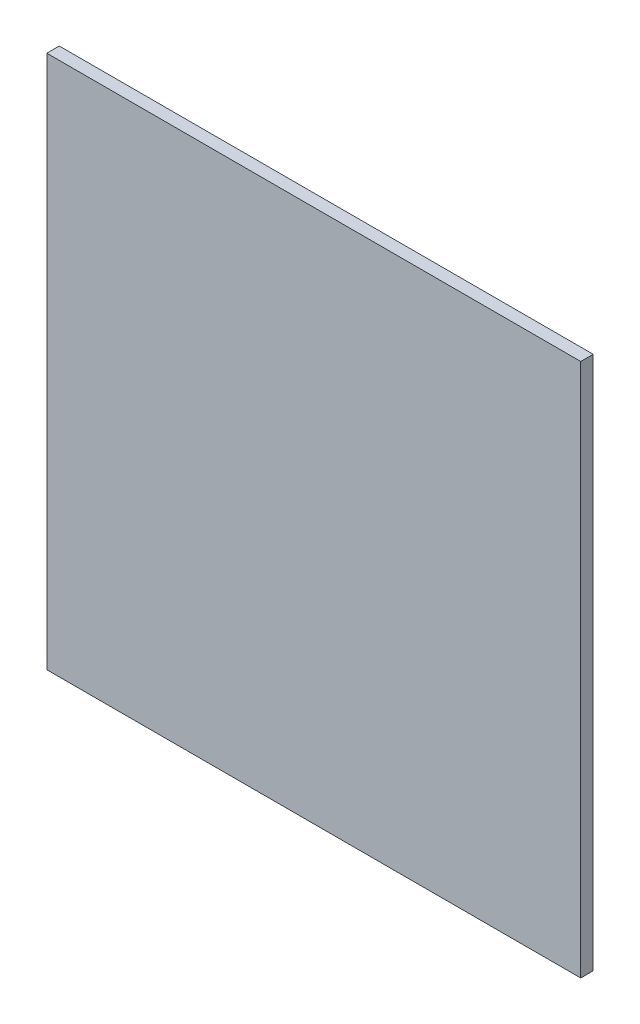
ISO-10303-21;
HEADER;
FILE_DESCRIPTION(('STEP AP214'),'2;1');
FILE_NAME('part.step','',(''),(''),'','','');
FILE_SCHEMA(('AUTOMOTIVE_DESIGN { 1 0 10303 214 1 1 1 1 }'));
ENDSEC;
DATA;
#1=APPLICATION_CONTEXT('core data for automotive mechanical design processes');
#2=APPLICATION_PROTOCOL_DEFINITION('international standard','automotive_design',2000,#1);
#3=PRODUCT_CONTEXT('',#1,'mechanical');
#4=PRODUCT('Part','Part','',(#3));
#5=PRODUCT_RELATED_PRODUCT_CATEGORY('part','',(#4));
#6=PRODUCT_DEFINITION_FORMATION('','',#4);
#7=PRODUCT_DEFINITION_CONTEXT('part definition',#1,'design');
#8=PRODUCT_DEFINITION('design','',#6,#7);
#9=PRODUCT_DEFINITION_SHAPE('','',#8);
#10=(LENGTH_UNIT() NAMED_UNIT(*) SI_UNIT(.MILLI.,.METRE.));
#11=(NAMED_UNIT(*) PLANE_ANGLE_UNIT() SI_UNIT($,.RADIAN.));
#12=(NAMED_UNIT(*) SI_UNIT($,.STERADIAN.) SOLID_ANGLE_UNIT());
#13=UNCERTAINTY_MEASURE_WITH_UNIT(LENGTH_MEASURE(1.E-05),#10,'distance_accuracy_value','');
#14=(GEOMETRIC_REPRESENTATION_CONTEXT(3) GLOBAL_UNCERTAINTY_ASSIGNED_CONTEXT((#13)) GLOBAL_UNIT_ASSIGNED_CONTEXT((#10,
#11,#12)) REPRESENTATION_CONTEXT('',''));
#15=CARTESIAN_POINT('',(0.,0.,0.));
#16=DIRECTION('',(0.,0.,1.));
#17=DIRECTION('',(1.,0.,0.));
#18=AXIS2_PLACEMENT_3D('',#15,#16,#17);
#19=CARTESIAN_POINT('',(24.888,11.684,0.));
#20=DIRECTION('',(0.,1.,0.));
#21=DIRECTION('',(1.,0.,0.));
#22=AXIS2_PLACEMENT_3D('',#19,#20,#21);
#23=PLANE('',#22);
#24=DIRECTION('',(1.,0.,0.));
#25=VECTOR('',#24,1.);
#26=CARTESIAN_POINT('',(24.888,11.684,0.03556));
#27=LINE('',#26,#25);
#28=CARTESIAN_POINT('',(24.888,11.684,0.03556));
#29=VERTEX_POINT('',#28);
#30=CARTESIAN_POINT('',(26.412,11.684,0.03556));
#31=VERTEX_POINT('',#30);
#32=EDGE_CURVE('E11',#29,#31,#27,.T.);
#33=ORIENTED_EDGE('',*,*,#32,.F.);
#34=DIRECTION('',(0.,0.,1.));
#35=VECTOR('',#34,1.);
#36=CARTESIAN_POINT('',(24.888,11.684,0.));
#37=LINE('',#36,#35);
#38=CARTESIAN_POINT('',(24.888,11.684,0.));
#39=VERTEX_POINT('',#38);
#40=EDGE_CURVE('E23',#39,#29,#37,.T.);
#41=ORIENTED_EDGE('',*,*,#40,.F.);
#42=DIRECTION('',(1.,0.,0.));
#43=VECTOR('',#42,1.);
#44=CARTESIAN_POINT('',(24.888,11.684,0.));
#45=LINE('',#44,#43);
#46=CARTESIAN_POINT('',(26.412,11.684,0.));
#47=VERTEX_POINT('',#46);
#48=EDGE_CURVE('E62',#39,#47,#45,.T.);
#49=ORIENTED_EDGE('',*,*,#48,.T.);
#50=DIRECTION('',(0.,0.,1.));
#51=VECTOR('',#50,1.);
#52=CARTESIAN_POINT('',(26.412,11.684,0.));
#53=LINE('',#52,#51);
#54=EDGE_CURVE('E84',#47,#31,#53,.T.);
#55=ORIENTED_EDGE('',*,*,#54,.T.);
#56=EDGE_LOOP('',(#33,#41,#49,#55));
#57=FACE_BOUND('',#56,.T.);
#58=ADVANCED_FACE('F16',(#57),#23,.F.);
#59=CARTESIAN_POINT('',(26.412,11.684,0.));
#60=DIRECTION('',(-1.,0.,0.));
#61=DIRECTION('',(0.,1.,0.));
#62=AXIS2_PLACEMENT_3D('',#59,#60,#61);
#63=PLANE('',#62);
#64=DIRECTION('',(0.,1.,0.));
#65=VECTOR('',#64,1.);
#66=CARTESIAN_POINT('',(26.412,11.684,0.03556));
#67=LINE('',#66,#65);
#68=CARTESIAN_POINT('',(26.412,13.208,0.03556));
#69=VERTEX_POINT('',#68);
#70=EDGE_CURVE('E82',#31,#69,#67,.T.);
#71=ORIENTED_EDGE('',*,*,#70,.F.);
#72=ORIENTED_EDGE('',*,*,#54,.F.);
#73=DIRECTION('',(0.,1.,0.));
#74=VECTOR('',#73,1.);
#75=CARTESIAN_POINT('',(26.412,11.684,0.));
#76=LINE('',#75,#74);
#77=CARTESIAN_POINT('',(26.412,13.208,0.));
#78=VERTEX_POINT('',#77);
#79=EDGE_CURVE('E80',#47,#78,#76,.T.);
#80=ORIENTED_EDGE('',*,*,#79,.T.);
#81=DIRECTION('',(0.,0.,1.));
#82=VECTOR('',#81,1.);
#83=CARTESIAN_POINT('',(26.412,13.208,0.));
#84=LINE('',#83,#82);
#85=EDGE_CURVE('E73',#78,#69,#84,.T.);
#86=ORIENTED_EDGE('',*,*,#85,.T.);
#87=EDGE_LOOP('',(#71,#72,#80,#86));
#88=FACE_BOUND('',#87,.T.);
#89=ADVANCED_FACE('F89',(#88),#63,.F.);
#90=CARTESIAN_POINT('',(26.412,13.208,0.));
#91=DIRECTION('',(0.,-1.,0.));
#92=DIRECTION('',(-1.,0.,0.));
#93=AXIS2_PLACEMENT_3D('',#90,#91,#92);
#94=PLANE('',#93);
#95=DIRECTION('',(-1.,0.,0.));
#96=VECTOR('',#95,1.);
#97=CARTESIAN_POINT('',(26.412,13.208,0.03556));
#98=LINE('',#97,#96);
#99=CARTESIAN_POINT('',(24.888,13.208,0.03556));
#100=VERTEX_POINT('',#99);
#101=EDGE_CURVE('E74',#69,#100,#98,.T.);
#102=ORIENTED_EDGE('',*,*,#101,.F.);
#103=ORIENTED_EDGE('',*,*,#85,.F.);
#104=DIRECTION('',(-1.,0.,0.));
#105=VECTOR('',#104,1.);
#106=CARTESIAN_POINT('',(26.412,13.208,0.));
#107=LINE('',#106,#105);
#108=CARTESIAN_POINT('',(24.888,13.208,0.));
#109=VERTEX_POINT('',#108);
#110=EDGE_CURVE('E59',#78,#109,#107,.T.);
#111=ORIENTED_EDGE('',*,*,#110,.T.);
#112=DIRECTION('',(0.,0.,1.));
#113=VECTOR('',#112,1.);
#114=CARTESIAN_POINT('',(24.888,13.208,0.));
#115=LINE('',#114,#113);
#116=EDGE_CURVE('E66',#109,#100,#115,.T.);
#117=ORIENTED_EDGE('',*,*,#116,.T.);
#118=EDGE_LOOP('',(#102,#103,#111,#117));
#119=FACE_BOUND('',#118,.T.);
#120=ADVANCED_FACE('F71',(#119),#94,.F.);
#121=CARTESIAN_POINT('',(24.888,13.208,0.));
#122=DIRECTION('',(1.,0.,0.));
#123=DIRECTION('',(0.,-1.,0.));
#124=AXIS2_PLACEMENT_3D('',#121,#122,#123);
#125=PLANE('',#124);
#126=DIRECTION('',(0.,-1.,0.));
#127=VECTOR('',#126,1.);
#128=CARTESIAN_POINT('',(24.888,13.208,0.03556));
#129=LINE('',#128,#127);
#130=EDGE_CURVE('E63',#100,#29,#129,.T.);
#131=ORIENTED_EDGE('',*,*,#130,.F.);
#132=ORIENTED_EDGE('',*,*,#116,.F.);
#133=DIRECTION('',(0.,-1.,0.));
#134=VECTOR('',#133,1.);
#135=CARTESIAN_POINT('',(24.888,13.208,0.));
#136=LINE('',#135,#134);
#137=EDGE_CURVE('E54',#109,#39,#136,.T.);
#138=ORIENTED_EDGE('',*,*,#137,.T.);
#139=ORIENTED_EDGE('',*,*,#40,.T.);
#140=EDGE_LOOP('',(#131,#132,#138,#139));
#141=FACE_BOUND('',#140,.T.);
#142=ADVANCED_FACE('F67',(#141),#125,.F.);
#143=CARTESIAN_POINT('',(25.65,12.446,0.));
#144=DIRECTION('',(0.,0.,1.));
#145=DIRECTION('',(1.,0.,0.));
#146=AXIS2_PLACEMENT_3D('',#143,#144,#145);
#147=PLANE('',#146);
#148=ORIENTED_EDGE('',*,*,#137,.F.);
#149=ORIENTED_EDGE('',*,*,#110,.F.);
#150=ORIENTED_EDGE('',*,*,#79,.F.);
#151=ORIENTED_EDGE('',*,*,#48,.F.);
#152=EDGE_LOOP('',(#148,#149,#150,#151));
#153=FACE_BOUND('',#152,.T.);
#154=ADVANCED_FACE('F56',(#153),#147,.F.);
#155=CARTESIAN_POINT('',(25.65,12.446,0.03556));
#156=DIRECTION('',(0.,0.,1.));
#157=DIRECTION('',(1.,0.,0.));
#158=AXIS2_PLACEMENT_3D('',#155,#156,#157);
#159=PLANE('',#158);
#160=ORIENTED_EDGE('',*,*,#32,.T.);
#161=ORIENTED_EDGE('',*,*,#70,.T.);
#162=ORIENTED_EDGE('',*,*,#101,.T.);
#163=ORIENTED_EDGE('',*,*,#130,.T.);
#164=EDGE_LOOP('',(#160,#161,#162,#163));
#165=FACE_BOUND('',#164,.T.);
#166=ADVANCED_FACE('F90',(#165),#159,.T.);
#167=CLOSED_SHELL('',(#58,#89,#120,#142,#154,#166));
#168=MANIFOLD_SOLID_BREP('B1',#167);
#169=ADVANCED_BREP_SHAPE_REPRESENTATION('',(#18,#168),#14);
#170=SHAPE_DEFINITION_REPRESENTATION(#9,#169);
ENDSEC;
END-ISO-10303-21;
